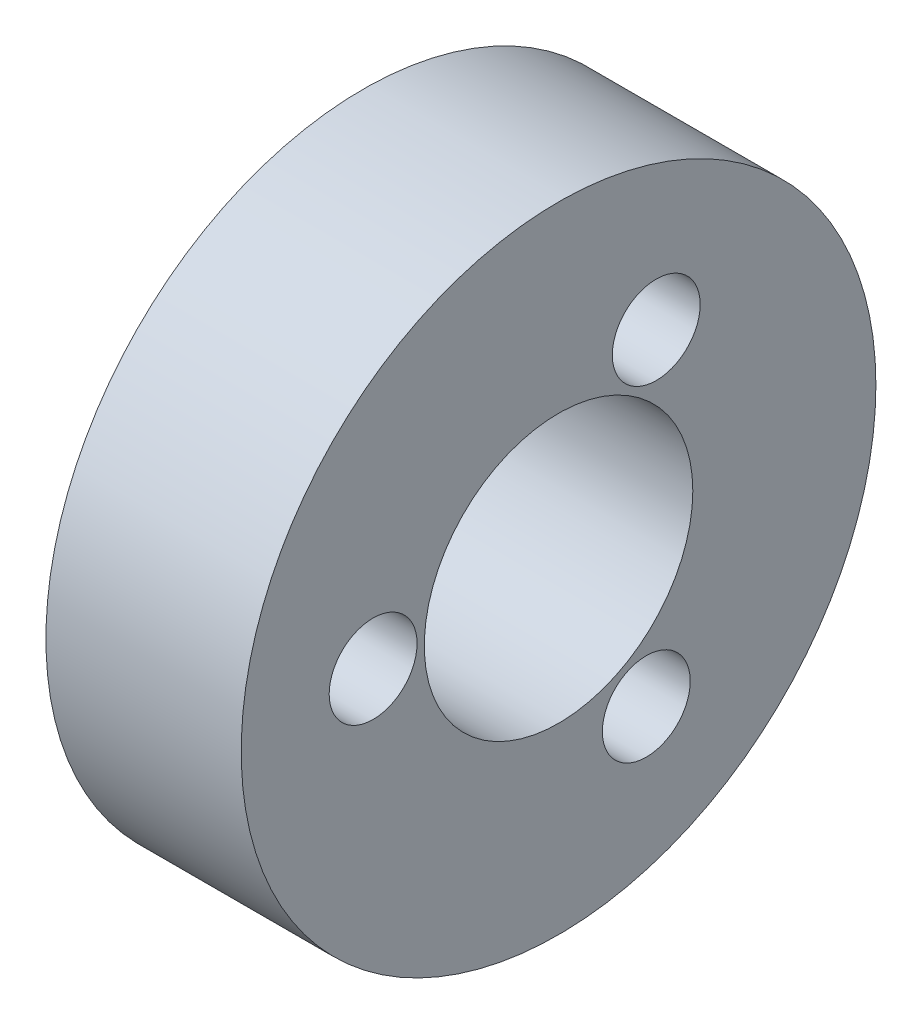
ISO-10303-21;
HEADER;
FILE_DESCRIPTION(('STEP AP214'),'2;1');
FILE_NAME('part.step','',(''),(''),'','','');
FILE_SCHEMA(('AUTOMOTIVE_DESIGN { 1 0 10303 214 1 1 1 1 }'));
ENDSEC;
DATA;
#1=APPLICATION_CONTEXT('core data for automotive mechanical design processes');
#2=APPLICATION_PROTOCOL_DEFINITION('international standard','automotive_design',2000,#1);
#3=PRODUCT_CONTEXT('',#1,'mechanical');
#4=PRODUCT('Part','Part','',(#3));
#5=PRODUCT_RELATED_PRODUCT_CATEGORY('part','',(#4));
#6=PRODUCT_DEFINITION_FORMATION('','',#4);
#7=PRODUCT_DEFINITION_CONTEXT('part definition',#1,'design');
#8=PRODUCT_DEFINITION('design','',#6,#7);
#9=PRODUCT_DEFINITION_SHAPE('','',#8);
#10=(LENGTH_UNIT() NAMED_UNIT(*) SI_UNIT(.MILLI.,.METRE.));
#11=(NAMED_UNIT(*) PLANE_ANGLE_UNIT() SI_UNIT($,.RADIAN.));
#12=(NAMED_UNIT(*) SI_UNIT($,.STERADIAN.) SOLID_ANGLE_UNIT());
#13=UNCERTAINTY_MEASURE_WITH_UNIT(LENGTH_MEASURE(1.E-05),#10,'distance_accuracy_value','');
#14=(GEOMETRIC_REPRESENTATION_CONTEXT(3) GLOBAL_UNCERTAINTY_ASSIGNED_CONTEXT((#13)) GLOBAL_UNIT_ASSIGNED_CONTEXT((#10,
#11,#12)) REPRESENTATION_CONTEXT('',''));
#15=CARTESIAN_POINT('',(0.,0.,0.));
#16=DIRECTION('',(0.,0.,1.));
#17=DIRECTION('',(1.,0.,0.));
#18=AXIS2_PLACEMENT_3D('',#15,#16,#17);
#19=CARTESIAN_POINT('',(4.,0.,0.));
#20=DIRECTION('',(-1.,0.,0.));
#21=DIRECTION('',(0.,0.,1.));
#22=AXIS2_PLACEMENT_3D('',#19,#20,#21);
#23=CYLINDRICAL_SURFACE('',#22,6.5);
#24=CARTESIAN_POINT('',(4.,0.,0.));
#25=DIRECTION('',(1.,0.,0.));
#26=DIRECTION('',(0.,0.,-1.));
#27=AXIS2_PLACEMENT_3D('',#24,#25,#26);
#28=CIRCLE('',#27,6.5);
#29=CARTESIAN_POINT('',(4.,0.,-6.5));
#30=VERTEX_POINT('',#29);
#31=EDGE_CURVE('E10',#30,#30,#28,.T.);
#32=ORIENTED_EDGE('',*,*,#31,.F.);
#33=EDGE_LOOP('',(#32));
#34=FACE_BOUND('',#33,.T.);
#35=CARTESIAN_POINT('',(0.,0.,0.));
#36=DIRECTION('',(1.,0.,0.));
#37=DIRECTION('',(0.,0.,-1.));
#38=AXIS2_PLACEMENT_3D('',#35,#36,#37);
#39=CIRCLE('',#38,6.5);
#40=CARTESIAN_POINT('',(0.,0.,-6.5));
#41=VERTEX_POINT('',#40);
#42=EDGE_CURVE('E37',#41,#41,#39,.T.);
#43=ORIENTED_EDGE('',*,*,#42,.T.);
#44=EDGE_LOOP('',(#43));
#45=FACE_BOUND('',#44,.T.);
#46=ADVANCED_FACE('F30',(#34,#45),#23,.T.);
#47=CARTESIAN_POINT('',(4.,0.,0.));
#48=DIRECTION('',(1.,0.,0.));
#49=DIRECTION('',(0.,0.,-1.));
#50=AXIS2_PLACEMENT_3D('',#47,#48,#49);
#51=PLANE('',#50);
#52=CARTESIAN_POINT('',(4.,0.117701351904959,3.79817671939586));
#53=DIRECTION('',(1.,0.,0.));
#54=DIRECTION('',(0.,0.,-1.));
#55=AXIS2_PLACEMENT_3D('',#52,#53,#54);
#56=CIRCLE('',#55,0.899999999999999);
#57=CARTESIAN_POINT('',(4.,0.117701351904959,2.89817671939586));
#58=VERTEX_POINT('',#57);
#59=EDGE_CURVE('E52',#58,#58,#56,.T.);
#60=ORIENTED_EDGE('',*,*,#59,.F.);
#61=EDGE_LOOP('',(#60));
#62=FACE_BOUND('',#61,.T.);
#63=CARTESIAN_POINT('',(4.,-3.34816820301171,-1.79715599888834));
#64=DIRECTION('',(1.,0.,0.));
#65=DIRECTION('',(0.,0.,-1.));
#66=AXIS2_PLACEMENT_3D('',#63,#64,#65);
#67=CIRCLE('',#66,0.9);
#68=CARTESIAN_POINT('',(4.,-3.34816820301171,-2.69715599888834));
#69=VERTEX_POINT('',#68);
#70=EDGE_CURVE('E55',#69,#69,#67,.T.);
#71=ORIENTED_EDGE('',*,*,#70,.F.);
#72=EDGE_LOOP('',(#71));
#73=FACE_BOUND('',#72,.T.);
#74=CARTESIAN_POINT('',(4.,3.23046685110699,-2.00102072050714));
#75=DIRECTION('',(1.,0.,0.));
#76=DIRECTION('',(0.,0.,-1.));
#77=AXIS2_PLACEMENT_3D('',#74,#75,#76);
#78=CIRCLE('',#77,0.900000000000001);
#79=CARTESIAN_POINT('',(4.,3.23046685110699,-2.90102072050714));
#80=VERTEX_POINT('',#79);
#81=EDGE_CURVE('E46',#80,#80,#78,.T.);
#82=ORIENTED_EDGE('',*,*,#81,.F.);
#83=EDGE_LOOP('',(#82));
#84=FACE_BOUND('',#83,.T.);
#85=CARTESIAN_POINT('',(4.,0.,0.));
#86=DIRECTION('',(1.,0.,0.));
#87=DIRECTION('',(0.,0.,-1.));
#88=AXIS2_PLACEMENT_3D('',#85,#86,#87);
#89=CIRCLE('',#88,2.75);
#90=CARTESIAN_POINT('',(4.,0.,-2.75));
#91=VERTEX_POINT('',#90);
#92=EDGE_CURVE('E43',#91,#91,#89,.T.);
#93=ORIENTED_EDGE('',*,*,#92,.F.);
#94=EDGE_LOOP('',(#93));
#95=FACE_BOUND('',#94,.T.);
#96=ORIENTED_EDGE('',*,*,#31,.T.);
#97=EDGE_LOOP('',(#96));
#98=FACE_BOUND('',#97,.T.);
#99=ADVANCED_FACE('F71',(#62,#73,#84,#95,#98),#51,.T.);
#100=CARTESIAN_POINT('',(0.,0.,0.));
#101=DIRECTION('',(1.,0.,0.));
#102=DIRECTION('',(0.,0.,-1.));
#103=AXIS2_PLACEMENT_3D('',#100,#101,#102);
#104=PLANE('',#103);
#105=CARTESIAN_POINT('',(0.,0.117701351904959,3.79817671939586));
#106=DIRECTION('',(-1.,0.,0.));
#107=DIRECTION('',(0.,0.,1.));
#108=AXIS2_PLACEMENT_3D('',#105,#106,#107);
#109=CIRCLE('',#108,0.899999999999999);
#110=CARTESIAN_POINT('',(0.,0.117701351904959,4.69817671939586));
#111=VERTEX_POINT('',#110);
#112=EDGE_CURVE('E58',#111,#111,#109,.T.);
#113=ORIENTED_EDGE('',*,*,#112,.F.);
#114=EDGE_LOOP('',(#113));
#115=FACE_BOUND('',#114,.T.);
#116=CARTESIAN_POINT('',(0.,-3.34816820301171,-1.79715599888834));
#117=DIRECTION('',(-1.,0.,0.));
#118=DIRECTION('',(0.,0.,1.));
#119=AXIS2_PLACEMENT_3D('',#116,#117,#118);
#120=CIRCLE('',#119,0.9);
#121=CARTESIAN_POINT('',(0.,-3.34816820301171,-0.897155998888343));
#122=VERTEX_POINT('',#121);
#123=EDGE_CURVE('E59',#122,#122,#120,.T.);
#124=ORIENTED_EDGE('',*,*,#123,.F.);
#125=EDGE_LOOP('',(#124));
#126=FACE_BOUND('',#125,.T.);
#127=CARTESIAN_POINT('',(0.,3.23046685110699,-2.00102072050714));
#128=DIRECTION('',(-1.,0.,0.));
#129=DIRECTION('',(0.,0.,1.));
#130=AXIS2_PLACEMENT_3D('',#127,#128,#129);
#131=CIRCLE('',#130,0.900000000000001);
#132=CARTESIAN_POINT('',(0.,3.23046685110699,-1.10102072050714));
#133=VERTEX_POINT('',#132);
#134=EDGE_CURVE('E49',#133,#133,#131,.T.);
#135=ORIENTED_EDGE('',*,*,#134,.F.);
#136=EDGE_LOOP('',(#135));
#137=FACE_BOUND('',#136,.T.);
#138=CARTESIAN_POINT('',(0.,0.,0.));
#139=DIRECTION('',(1.,0.,0.));
#140=DIRECTION('',(0.,0.,-1.));
#141=AXIS2_PLACEMENT_3D('',#138,#139,#140);
#142=CIRCLE('',#141,2.75);
#143=CARTESIAN_POINT('',(0.,0.,-2.75));
#144=VERTEX_POINT('',#143);
#145=EDGE_CURVE('E33',#144,#144,#142,.T.);
#146=ORIENTED_EDGE('',*,*,#145,.T.);
#147=EDGE_LOOP('',(#146));
#148=FACE_BOUND('',#147,.T.);
#149=ORIENTED_EDGE('',*,*,#42,.F.);
#150=EDGE_LOOP('',(#149));
#151=FACE_BOUND('',#150,.T.);
#152=ADVANCED_FACE('F67',(#115,#126,#137,#148,#151),#104,.F.);
#153=CARTESIAN_POINT('',(-3.,0.,0.));
#154=DIRECTION('',(1.,0.,0.));
#155=DIRECTION('',(0.,0.,-1.));
#156=AXIS2_PLACEMENT_3D('',#153,#154,#155);
#157=CYLINDRICAL_SURFACE('',#156,2.75);
#158=ORIENTED_EDGE('',*,*,#92,.T.);
#159=EDGE_LOOP('',(#158));
#160=FACE_BOUND('',#159,.T.);
#161=ORIENTED_EDGE('',*,*,#145,.F.);
#162=EDGE_LOOP('',(#161));
#163=FACE_BOUND('',#162,.T.);
#164=ADVANCED_FACE('F70',(#160,#163),#157,.F.);
#165=CARTESIAN_POINT('',(7.,3.23046685110699,-2.00102072050714));
#166=DIRECTION('',(-1.,0.,0.));
#167=DIRECTION('',(0.,0.,1.));
#168=AXIS2_PLACEMENT_3D('',#165,#166,#167);
#169=CYLINDRICAL_SURFACE('',#168,0.900000000000001);
#170=ORIENTED_EDGE('',*,*,#81,.T.);
#171=EDGE_LOOP('',(#170));
#172=FACE_BOUND('',#171,.T.);
#173=ORIENTED_EDGE('',*,*,#134,.T.);
#174=EDGE_LOOP('',(#173));
#175=FACE_BOUND('',#174,.T.);
#176=ADVANCED_FACE('F95',(#172,#175),#169,.F.);
#177=CARTESIAN_POINT('',(7.,-3.34816820301171,-1.79715599888834));
#178=DIRECTION('',(-1.,0.,0.));
#179=DIRECTION('',(0.,0.,1.));
#180=AXIS2_PLACEMENT_3D('',#177,#178,#179);
#181=CYLINDRICAL_SURFACE('',#180,0.9);
#182=ORIENTED_EDGE('',*,*,#70,.T.);
#183=EDGE_LOOP('',(#182));
#184=FACE_BOUND('',#183,.T.);
#185=ORIENTED_EDGE('',*,*,#123,.T.);
#186=EDGE_LOOP('',(#185));
#187=FACE_BOUND('',#186,.T.);
#188=ADVANCED_FACE('F99',(#184,#187),#181,.F.);
#189=CARTESIAN_POINT('',(7.,0.117701351904959,3.79817671939586));
#190=DIRECTION('',(-1.,0.,0.));
#191=DIRECTION('',(0.,0.,1.));
#192=AXIS2_PLACEMENT_3D('',#189,#190,#191);
#193=CYLINDRICAL_SURFACE('',#192,0.899999999999999);
#194=ORIENTED_EDGE('',*,*,#59,.T.);
#195=EDGE_LOOP('',(#194));
#196=FACE_BOUND('',#195,.T.);
#197=ORIENTED_EDGE('',*,*,#112,.T.);
#198=EDGE_LOOP('',(#197));
#199=FACE_BOUND('',#198,.T.);
#200=ADVANCED_FACE('F65',(#196,#199),#193,.F.);
#201=CLOSED_SHELL('',(#46,#99,#152,#164,#176,#188,#200));
#202=MANIFOLD_SOLID_BREP('B2',#201);
#203=ADVANCED_BREP_SHAPE_REPRESENTATION('',(#18,#202),#14);
#204=SHAPE_DEFINITION_REPRESENTATION(#9,#203);
ENDSEC;
END-ISO-10303-21;
